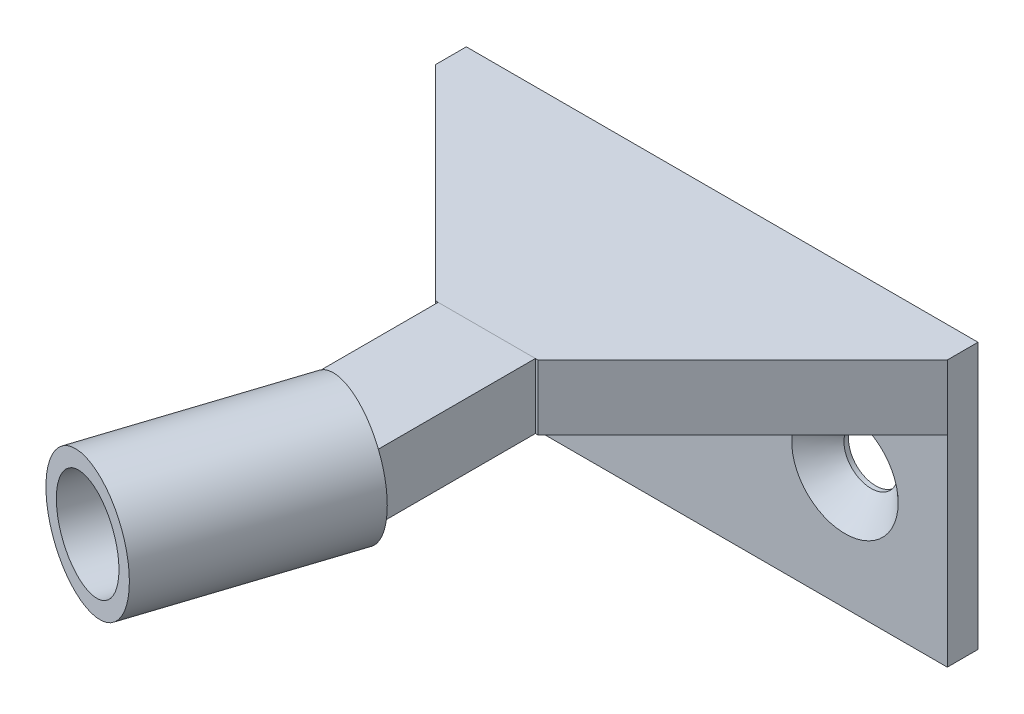
ISO-10303-21;
HEADER;
FILE_DESCRIPTION(('STEP AP214'),'2;1');
FILE_NAME('part.step','',(''),(''),'','','');
FILE_SCHEMA(('AUTOMOTIVE_DESIGN { 1 0 10303 214 1 1 1 1 }'));
ENDSEC;
DATA;
#1=APPLICATION_CONTEXT('core data for automotive mechanical design processes');
#2=APPLICATION_PROTOCOL_DEFINITION('international standard','automotive_design',2000,#1);
#3=PRODUCT_CONTEXT('',#1,'mechanical');
#4=PRODUCT('Part','Part','',(#3));
#5=PRODUCT_RELATED_PRODUCT_CATEGORY('part','',(#4));
#6=PRODUCT_DEFINITION_FORMATION('','',#4);
#7=PRODUCT_DEFINITION_CONTEXT('part definition',#1,'design');
#8=PRODUCT_DEFINITION('design','',#6,#7);
#9=PRODUCT_DEFINITION_SHAPE('','',#8);
#10=(LENGTH_UNIT() NAMED_UNIT(*) SI_UNIT(.MILLI.,.METRE.));
#11=(NAMED_UNIT(*) PLANE_ANGLE_UNIT() SI_UNIT($,.RADIAN.));
#12=(NAMED_UNIT(*) SI_UNIT($,.STERADIAN.) SOLID_ANGLE_UNIT());
#13=UNCERTAINTY_MEASURE_WITH_UNIT(LENGTH_MEASURE(1.E-05),#10,'distance_accuracy_value','');
#14=(GEOMETRIC_REPRESENTATION_CONTEXT(3) GLOBAL_UNCERTAINTY_ASSIGNED_CONTEXT((#13)) GLOBAL_UNIT_ASSIGNED_CONTEXT((#10,
#11,#12)) REPRESENTATION_CONTEXT('',''));
#15=CARTESIAN_POINT('',(0.,0.,0.));
#16=DIRECTION('',(0.,0.,1.));
#17=DIRECTION('',(1.,0.,0.));
#18=AXIS2_PLACEMENT_3D('',#15,#16,#17);
#19=CARTESIAN_POINT('',(0.,0.,23.));
#20=DIRECTION('',(0.,0.,1.));
#21=DIRECTION('',(1.,0.,0.));
#22=AXIS2_PLACEMENT_3D('',#19,#20,#21);
#23=PLANE('',#22);
#24=DIRECTION('',(0.,1.,0.));
#25=VECTOR('',#24,1.);
#26=CARTESIAN_POINT('',(4.75036715079468,6.64708638221506,23.));
#27=LINE('',#26,#25);
#28=CARTESIAN_POINT('',(4.75036715079468,6.65,23.));
#29=VERTEX_POINT('',#28);
#30=CARTESIAN_POINT('',(4.75036715079468,13.,23.));
#31=VERTEX_POINT('',#30);
#32=EDGE_CURVE('E12',#29,#31,#27,.T.);
#33=ORIENTED_EDGE('',*,*,#32,.F.);
#34=DIRECTION('',(1.,0.,0.));
#35=VECTOR('',#34,1.);
#36=CARTESIAN_POINT('',(-5.,6.65,23.));
#37=LINE('',#36,#35);
#38=CARTESIAN_POINT('',(5.,6.65,23.));
#39=VERTEX_POINT('',#38);
#40=EDGE_CURVE('E266',#29,#39,#37,.T.);
#41=ORIENTED_EDGE('',*,*,#40,.T.);
#42=DIRECTION('',(0.,-1.,0.));
#43=VECTOR('',#42,1.);
#44=CARTESIAN_POINT('',(5.,13.,23.));
#45=LINE('',#44,#43);
#46=CARTESIAN_POINT('',(5.,13.,23.));
#47=VERTEX_POINT('',#46);
#48=EDGE_CURVE('E403',#47,#39,#45,.T.);
#49=ORIENTED_EDGE('',*,*,#48,.F.);
#50=DIRECTION('',(1.,0.,0.));
#51=VECTOR('',#50,1.);
#52=CARTESIAN_POINT('',(-5.,13.,23.));
#53=LINE('',#52,#51);
#54=EDGE_CURVE('E70',#31,#47,#53,.T.);
#55=ORIENTED_EDGE('',*,*,#54,.F.);
#56=EDGE_LOOP('',(#33,#41,#49,#55));
#57=FACE_BOUND('',#56,.T.);
#58=ADVANCED_FACE('F53',(#57),#23,.T.);
#59=CARTESIAN_POINT('',(25.,-13.,3.));
#60=DIRECTION('',(-1.,0.,0.));
#61=DIRECTION('',(0.,0.,1.));
#62=AXIS2_PLACEMENT_3D('',#59,#60,#61);
#63=PLANE('',#62);
#64=DIRECTION('',(0.,1.,0.));
#65=VECTOR('',#64,1.);
#66=CARTESIAN_POINT('',(25.,-13.,0.));
#67=LINE('',#66,#65);
#68=CARTESIAN_POINT('',(25.,-13.,0.));
#69=VERTEX_POINT('',#68);
#70=CARTESIAN_POINT('',(25.,13.,0.));
#71=VERTEX_POINT('',#70);
#72=EDGE_CURVE('E348',#69,#71,#67,.T.);
#73=ORIENTED_EDGE('',*,*,#72,.T.);
#74=DIRECTION('',(0.,0.,-1.));
#75=VECTOR('',#74,1.);
#76=CARTESIAN_POINT('',(25.,13.,3.));
#77=LINE('',#76,#75);
#78=CARTESIAN_POINT('',(25.,13.,3.));
#79=VERTEX_POINT('',#78);
#80=EDGE_CURVE('E212',#79,#71,#77,.T.);
#81=ORIENTED_EDGE('',*,*,#80,.F.);
#82=DIRECTION('',(0.,1.,0.));
#83=VECTOR('',#82,1.);
#84=CARTESIAN_POINT('',(25.,13.,3.));
#85=LINE('',#84,#83);
#86=CARTESIAN_POINT('',(25.,6.65,3.));
#87=VERTEX_POINT('',#86);
#88=EDGE_CURVE('E347',#87,#79,#85,.T.);
#89=ORIENTED_EDGE('',*,*,#88,.F.);
#90=DIRECTION('',(0.,1.,0.));
#91=VECTOR('',#90,1.);
#92=CARTESIAN_POINT('',(25.,-13.,3.));
#93=LINE('',#92,#91);
#94=CARTESIAN_POINT('',(25.,-13.,3.));
#95=VERTEX_POINT('',#94);
#96=EDGE_CURVE('E373',#95,#87,#93,.T.);
#97=ORIENTED_EDGE('',*,*,#96,.F.);
#98=DIRECTION('',(0.,0.,-1.));
#99=VECTOR('',#98,1.);
#100=CARTESIAN_POINT('',(25.,-13.,3.));
#101=LINE('',#100,#99);
#102=EDGE_CURVE('E384',#95,#69,#101,.T.);
#103=ORIENTED_EDGE('',*,*,#102,.T.);
#104=EDGE_LOOP('',(#73,#81,#89,#97,#103));
#105=FACE_BOUND('',#104,.T.);
#106=ADVANCED_FACE('F55',(#105),#63,.F.);
#107=CARTESIAN_POINT('',(-25.,13.,3.));
#108=DIRECTION('',(0.,-1.,0.));
#109=DIRECTION('',(0.,0.,-1.));
#110=AXIS2_PLACEMENT_3D('',#107,#108,#109);
#111=PLANE('',#110);
#112=DIRECTION('',(-1.,0.,0.));
#113=VECTOR('',#112,1.);
#114=CARTESIAN_POINT('',(-25.,13.,0.));
#115=LINE('',#114,#113);
#116=CARTESIAN_POINT('',(-25.,13.,0.));
#117=VERTEX_POINT('',#116);
#118=EDGE_CURVE('E356',#71,#117,#115,.T.);
#119=ORIENTED_EDGE('',*,*,#118,.T.);
#120=DIRECTION('',(0.,0.,-1.));
#121=VECTOR('',#120,1.);
#122=CARTESIAN_POINT('',(-25.,13.,3.));
#123=LINE('',#122,#121);
#124=CARTESIAN_POINT('',(-25.,13.,3.));
#125=VERTEX_POINT('',#124);
#126=EDGE_CURVE('E364',#125,#117,#123,.T.);
#127=ORIENTED_EDGE('',*,*,#126,.F.);
#128=DIRECTION('',(-0.707106781186548,0.,-0.707106781186547));
#129=VECTOR('',#128,1.);
#130=CARTESIAN_POINT('',(-5.,13.,23.));
#131=LINE('',#130,#129);
#132=CARTESIAN_POINT('',(-5.,13.,23.));
#133=VERTEX_POINT('',#132);
#134=EDGE_CURVE('E361',#133,#125,#131,.T.);
#135=ORIENTED_EDGE('',*,*,#134,.F.);
#136=CARTESIAN_POINT('',(-4.75150429364503,13.,23.));
#137=VERTEX_POINT('',#136);
#138=EDGE_CURVE('E289',#133,#137,#53,.T.);
#139=ORIENTED_EDGE('',*,*,#138,.T.);
#140=EDGE_CURVE('E407',#137,#31,#53,.T.);
#141=ORIENTED_EDGE('',*,*,#140,.T.);
#142=ORIENTED_EDGE('',*,*,#54,.T.);
#143=DIRECTION('',(0.707106781186548,0.,-0.707106781186547));
#144=VECTOR('',#143,1.);
#145=CARTESIAN_POINT('',(5.,13.,23.));
#146=LINE('',#145,#144);
#147=EDGE_CURVE('E358',#47,#79,#146,.T.);
#148=ORIENTED_EDGE('',*,*,#147,.T.);
#149=ORIENTED_EDGE('',*,*,#80,.T.);
#150=EDGE_LOOP('',(#119,#127,#135,#139,#141,#142,#148,#149));
#151=FACE_BOUND('',#150,.T.);
#152=ADVANCED_FACE('F327',(#151),#111,.F.);
#153=CARTESIAN_POINT('',(-25.,-13.,3.));
#154=DIRECTION('',(1.,0.,0.));
#155=DIRECTION('',(0.,0.,-1.));
#156=AXIS2_PLACEMENT_3D('',#153,#154,#155);
#157=PLANE('',#156);
#158=DIRECTION('',(0.,-1.,0.));
#159=VECTOR('',#158,1.);
#160=CARTESIAN_POINT('',(-25.,-13.,0.));
#161=LINE('',#160,#159);
#162=CARTESIAN_POINT('',(-25.,-13.,0.));
#163=VERTEX_POINT('',#162);
#164=EDGE_CURVE('E387',#117,#163,#161,.T.);
#165=ORIENTED_EDGE('',*,*,#164,.T.);
#166=DIRECTION('',(0.,0.,-1.));
#167=VECTOR('',#166,1.);
#168=CARTESIAN_POINT('',(-25.,-13.,3.));
#169=LINE('',#168,#167);
#170=CARTESIAN_POINT('',(-25.,-13.,3.));
#171=VERTEX_POINT('',#170);
#172=EDGE_CURVE('E368',#171,#163,#169,.T.);
#173=ORIENTED_EDGE('',*,*,#172,.F.);
#174=DIRECTION('',(0.,-1.,0.));
#175=VECTOR('',#174,1.);
#176=CARTESIAN_POINT('',(-25.,-13.,3.));
#177=LINE('',#176,#175);
#178=CARTESIAN_POINT('',(-25.,6.65,3.));
#179=VERTEX_POINT('',#178);
#180=EDGE_CURVE('E346',#179,#171,#177,.T.);
#181=ORIENTED_EDGE('',*,*,#180,.F.);
#182=DIRECTION('',(0.,1.,0.));
#183=VECTOR('',#182,1.);
#184=CARTESIAN_POINT('',(-25.,0.,3.));
#185=LINE('',#184,#183);
#186=EDGE_CURVE('E337',#125,#179,#185,.F.);
#187=ORIENTED_EDGE('',*,*,#186,.F.);
#188=ORIENTED_EDGE('',*,*,#126,.T.);
#189=EDGE_LOOP('',(#165,#173,#181,#187,#188));
#190=FACE_BOUND('',#189,.T.);
#191=ADVANCED_FACE('F324',(#190),#157,.F.);
#192=CARTESIAN_POINT('',(-25.,-13.,3.));
#193=DIRECTION('',(0.,1.,0.));
#194=DIRECTION('',(0.,0.,1.));
#195=AXIS2_PLACEMENT_3D('',#192,#193,#194);
#196=PLANE('',#195);
#197=DIRECTION('',(1.,0.,0.));
#198=VECTOR('',#197,1.);
#199=CARTESIAN_POINT('',(-25.,-13.,0.));
#200=LINE('',#199,#198);
#201=EDGE_CURVE('E377',#163,#69,#200,.T.);
#202=ORIENTED_EDGE('',*,*,#201,.T.);
#203=ORIENTED_EDGE('',*,*,#102,.F.);
#204=DIRECTION('',(1.,0.,0.));
#205=VECTOR('',#204,1.);
#206=CARTESIAN_POINT('',(-25.,-13.,3.));
#207=LINE('',#206,#205);
#208=EDGE_CURVE('E345',#171,#95,#207,.T.);
#209=ORIENTED_EDGE('',*,*,#208,.F.);
#210=ORIENTED_EDGE('',*,*,#172,.T.);
#211=EDGE_LOOP('',(#202,#203,#209,#210));
#212=FACE_BOUND('',#211,.T.);
#213=ADVANCED_FACE('F317',(#212),#196,.F.);
#214=CARTESIAN_POINT('',(0.,0.,3.));
#215=DIRECTION('',(0.,0.,-1.));
#216=DIRECTION('',(-1.,0.,0.));
#217=AXIS2_PLACEMENT_3D('',#214,#215,#216);
#218=PLANE('',#217);
#219=CARTESIAN_POINT('',(-15.,-1.5,3.));
#220=DIRECTION('',(0.,0.,1.));
#221=DIRECTION('',(1.,0.,0.));
#222=AXIS2_PLACEMENT_3D('',#219,#220,#221);
#223=CIRCLE('',#222,5.2);
#224=CARTESIAN_POINT('',(-9.8,-1.5,3.));
#225=VERTEX_POINT('',#224);
#226=EDGE_CURVE('E630',#225,#225,#223,.T.);
#227=ORIENTED_EDGE('',*,*,#226,.F.);
#228=EDGE_LOOP('',(#227));
#229=FACE_BOUND('',#228,.T.);
#230=CARTESIAN_POINT('',(15.,-1.5,3.));
#231=DIRECTION('',(0.,0.,1.));
#232=DIRECTION('',(1.,0.,0.));
#233=AXIS2_PLACEMENT_3D('',#230,#231,#232);
#234=CIRCLE('',#233,5.2);
#235=CARTESIAN_POINT('',(20.2,-1.5,3.));
#236=VERTEX_POINT('',#235);
#237=EDGE_CURVE('E443',#236,#236,#234,.T.);
#238=ORIENTED_EDGE('',*,*,#237,.F.);
#239=EDGE_LOOP('',(#238));
#240=FACE_BOUND('',#239,.T.);
#241=ORIENTED_EDGE('',*,*,#96,.T.);
#242=DIRECTION('',(1.,0.,0.));
#243=VECTOR('',#242,1.);
#244=CARTESIAN_POINT('',(-25.,6.65,3.));
#245=LINE('',#244,#243);
#246=EDGE_CURVE('E349',#179,#87,#245,.T.);
#247=ORIENTED_EDGE('',*,*,#246,.F.);
#248=ORIENTED_EDGE('',*,*,#180,.T.);
#249=ORIENTED_EDGE('',*,*,#208,.T.);
#250=EDGE_LOOP('',(#241,#247,#248,#249));
#251=FACE_BOUND('',#250,.T.);
#252=ADVANCED_FACE('F314',(#229,#240,#251),#218,.F.);
#253=CARTESIAN_POINT('',(0.,0.,0.));
#254=DIRECTION('',(0.,0.,-1.));
#255=DIRECTION('',(-1.,0.,0.));
#256=AXIS2_PLACEMENT_3D('',#253,#254,#255);
#257=PLANE('',#256);
#258=CARTESIAN_POINT('',(-15.,-1.5,0.));
#259=DIRECTION('',(0.,0.,-1.));
#260=DIRECTION('',(-1.,0.,0.));
#261=AXIS2_PLACEMENT_3D('',#258,#259,#260);
#262=CIRCLE('',#261,2.64999999999999);
#263=CARTESIAN_POINT('',(-17.65,-1.5,0.));
#264=VERTEX_POINT('',#263);
#265=EDGE_CURVE('E57',#264,#264,#262,.T.);
#266=ORIENTED_EDGE('',*,*,#265,.F.);
#267=EDGE_LOOP('',(#266));
#268=FACE_BOUND('',#267,.T.);
#269=CARTESIAN_POINT('',(15.,-1.5,0.));
#270=DIRECTION('',(0.,0.,-1.));
#271=DIRECTION('',(-1.,0.,0.));
#272=AXIS2_PLACEMENT_3D('',#269,#270,#271);
#273=CIRCLE('',#272,2.64999999999999);
#274=CARTESIAN_POINT('',(12.35,-1.5,0.));
#275=VERTEX_POINT('',#274);
#276=EDGE_CURVE('E436',#275,#275,#273,.T.);
#277=ORIENTED_EDGE('',*,*,#276,.F.);
#278=EDGE_LOOP('',(#277));
#279=FACE_BOUND('',#278,.T.);
#280=ORIENTED_EDGE('',*,*,#72,.F.);
#281=ORIENTED_EDGE('',*,*,#201,.F.);
#282=ORIENTED_EDGE('',*,*,#164,.F.);
#283=ORIENTED_EDGE('',*,*,#118,.F.);
#284=EDGE_LOOP('',(#280,#281,#282,#283));
#285=FACE_BOUND('',#284,.T.);
#286=ADVANCED_FACE('F237',(#268,#279,#285),#257,.T.);
#287=DIRECTION('',(0.,-1.,0.));
#288=VECTOR('',#287,1.);
#289=CARTESIAN_POINT('',(-4.75150429364503,13.0004552442555,23.));
#290=LINE('',#289,#288);
#291=CARTESIAN_POINT('',(-4.75150429364502,6.65,23.));
#292=VERTEX_POINT('',#291);
#293=EDGE_CURVE('E62',#137,#292,#290,.T.);
#294=ORIENTED_EDGE('',*,*,#293,.F.);
#295=ORIENTED_EDGE('',*,*,#138,.F.);
#296=DIRECTION('',(0.,-1.,0.));
#297=VECTOR('',#296,1.);
#298=CARTESIAN_POINT('',(-5.,13.,23.));
#299=LINE('',#298,#297);
#300=CARTESIAN_POINT('',(-5.,6.65,23.));
#301=VERTEX_POINT('',#300);
#302=EDGE_CURVE('E223',#133,#301,#299,.T.);
#303=ORIENTED_EDGE('',*,*,#302,.T.);
#304=EDGE_CURVE('E405',#301,#292,#37,.T.);
#305=ORIENTED_EDGE('',*,*,#304,.T.);
#306=EDGE_LOOP('',(#294,#295,#303,#305));
#307=FACE_BOUND('',#306,.T.);
#308=ADVANCED_FACE('F226',(#307),#23,.T.);
#309=CARTESIAN_POINT('',(0.,6.65,0.));
#310=DIRECTION('',(0.,-1.,0.));
#311=DIRECTION('',(0.,0.,-1.));
#312=AXIS2_PLACEMENT_3D('',#309,#310,#311);
#313=PLANE('',#312);
#314=DIRECTION('',(-0.707106781186548,0.,-0.707106781186547));
#315=VECTOR('',#314,1.);
#316=CARTESIAN_POINT('',(-5.,6.65,23.));
#317=LINE('',#316,#315);
#318=EDGE_CURVE('E280',#301,#179,#317,.T.);
#319=ORIENTED_EDGE('',*,*,#318,.T.);
#320=ORIENTED_EDGE('',*,*,#246,.T.);
#321=DIRECTION('',(0.707106781186548,0.,-0.707106781186547));
#322=VECTOR('',#321,1.);
#323=CARTESIAN_POINT('',(5.,6.65,23.));
#324=LINE('',#323,#322);
#325=EDGE_CURVE('E288',#39,#87,#324,.T.);
#326=ORIENTED_EDGE('',*,*,#325,.F.);
#327=ORIENTED_EDGE('',*,*,#40,.F.);
#328=EDGE_CURVE('E409',#292,#29,#37,.T.);
#329=ORIENTED_EDGE('',*,*,#328,.F.);
#330=ORIENTED_EDGE('',*,*,#304,.F.);
#331=EDGE_LOOP('',(#319,#320,#326,#327,#329,#330));
#332=FACE_BOUND('',#331,.T.);
#333=ADVANCED_FACE('F236',(#332),#313,.T.);
#334=CARTESIAN_POINT('',(14.,0.,14.));
#335=DIRECTION('',(0.707106781186547,0.,0.707106781186548));
#336=DIRECTION('',(0.707106781186548,0.,-0.707106781186547));
#337=AXIS2_PLACEMENT_3D('',#334,#335,#336);
#338=PLANE('',#337);
#339=ORIENTED_EDGE('',*,*,#325,.T.);
#340=ORIENTED_EDGE('',*,*,#88,.T.);
#341=ORIENTED_EDGE('',*,*,#147,.F.);
#342=ORIENTED_EDGE('',*,*,#48,.T.);
#343=EDGE_LOOP('',(#339,#340,#341,#342));
#344=FACE_BOUND('',#343,.T.);
#345=ADVANCED_FACE('F312',(#344),#338,.T.);
#346=CARTESIAN_POINT('',(-14.,0.,14.));
#347=DIRECTION('',(-0.707106781186547,0.,0.707106781186548));
#348=DIRECTION('',(0.707106781186548,0.,0.707106781186547));
#349=AXIS2_PLACEMENT_3D('',#346,#347,#348);
#350=PLANE('',#349);
#351=ORIENTED_EDGE('',*,*,#134,.T.);
#352=ORIENTED_EDGE('',*,*,#186,.T.);
#353=ORIENTED_EDGE('',*,*,#318,.F.);
#354=ORIENTED_EDGE('',*,*,#302,.F.);
#355=EDGE_LOOP('',(#351,#352,#353,#354));
#356=FACE_BOUND('',#355,.T.);
#357=ADVANCED_FACE('F302',(#356),#350,.T.);
#358=CARTESIAN_POINT('',(0.,0.,23.));
#359=DIRECTION('',(0.,0.,1.));
#360=DIRECTION('',(1.,0.,0.));
#361=AXIS2_PLACEMENT_3D('',#358,#359,#360);
#362=PLANE('',#361);
#363=CARTESIAN_POINT('',(-4.75150429364502,6.64708638221506,23.));
#364=VERTEX_POINT('',#363);
#365=EDGE_CURVE('E206',#292,#364,#290,.T.);
#366=ORIENTED_EDGE('',*,*,#365,.F.);
#367=ORIENTED_EDGE('',*,*,#328,.T.);
#368=CARTESIAN_POINT('',(4.75036715079468,6.64708638221506,23.));
#369=VERTEX_POINT('',#368);
#370=EDGE_CURVE('E156',#369,#29,#27,.T.);
#371=ORIENTED_EDGE('',*,*,#370,.F.);
#372=DIRECTION('',(1.,0.,0.));
#373=VECTOR('',#372,1.);
#374=CARTESIAN_POINT('',(-4.75150429364502,6.64708638221506,23.));
#375=LINE('',#374,#373);
#376=EDGE_CURVE('E194',#364,#369,#375,.T.);
#377=ORIENTED_EDGE('',*,*,#376,.F.);
#378=EDGE_LOOP('',(#366,#367,#371,#377));
#379=FACE_BOUND('',#378,.T.);
#380=ADVANCED_FACE('F311',(#379),#362,.F.);
#381=DIRECTION('',(-0.999999998852268,4.79110096994007E-05,0.));
#382=VECTOR('',#381,1.);
#383=CARTESIAN_POINT('',(4.75036715079468,13.,23.));
#384=LINE('',#383,#382);
#385=CARTESIAN_POINT('',(-4.75150429364503,13.0004552442555,23.));
#386=VERTEX_POINT('',#385);
#387=EDGE_CURVE('E205',#31,#386,#384,.T.);
#388=ORIENTED_EDGE('',*,*,#387,.F.);
#389=ORIENTED_EDGE('',*,*,#140,.F.);
#390=EDGE_CURVE('E202',#386,#137,#290,.T.);
#391=ORIENTED_EDGE('',*,*,#390,.F.);
#392=EDGE_LOOP('',(#388,#389,#391));
#393=FACE_BOUND('',#392,.T.);
#394=ADVANCED_FACE('F421',(#393),#362,.F.);
#395=CARTESIAN_POINT('',(-4.75150429364503,13.0004552442555,57.7863261489491));
#396=DIRECTION('',(1.,0.,0.));
#397=DIRECTION('',(0.,1.,0.));
#398=AXIS2_PLACEMENT_3D('',#395,#396,#397);
#399=PLANE('',#398);
#400=DIRECTION('',(0.,-1.,0.));
#401=VECTOR('',#400,1.);
#402=CARTESIAN_POINT('',(-4.75150429364503,13.0004552442555,35.2573205165989));
#403=LINE('',#402,#401);
#404=CARTESIAN_POINT('',(-4.75150429364503,13.0004552442555,35.2573205165989));
#405=VERTEX_POINT('',#404);
#406=CARTESIAN_POINT('',(-4.75150429364503,6.64708638221506,35.2573205165989));
#407=VERTEX_POINT('',#406);
#408=EDGE_CURVE('E167',#405,#407,#403,.T.);
#409=ORIENTED_EDGE('',*,*,#408,.F.);
#410=DIRECTION('',(0.,0.,-1.));
#411=VECTOR('',#410,1.);
#412=CARTESIAN_POINT('',(-4.75150429364503,13.0004552442555,57.7863261489491));
#413=LINE('',#412,#411);
#414=EDGE_CURVE('E163',#405,#386,#413,.T.);
#415=ORIENTED_EDGE('',*,*,#414,.T.);
#416=ORIENTED_EDGE('',*,*,#390,.T.);
#417=ORIENTED_EDGE('',*,*,#293,.T.);
#418=ORIENTED_EDGE('',*,*,#365,.T.);
#419=DIRECTION('',(0.,0.,-1.));
#420=VECTOR('',#419,1.);
#421=CARTESIAN_POINT('',(-4.75150429364502,6.64708638221506,57.7863261489491));
#422=LINE('',#421,#420);
#423=EDGE_CURVE('E425',#407,#364,#422,.T.);
#424=ORIENTED_EDGE('',*,*,#423,.F.);
#425=EDGE_LOOP('',(#409,#415,#416,#417,#418,#424));
#426=FACE_BOUND('',#425,.T.);
#427=ADVANCED_FACE('F423',(#426),#399,.F.);
#428=CARTESIAN_POINT('',(4.75036715079468,13.,57.7863261489491));
#429=DIRECTION('',(-4.79110096994007E-05,-0.999999998852267,0.));
#430=DIRECTION('',(0.999999998852268,-4.79110096994008E-05,0.));
#431=AXIS2_PLACEMENT_3D('',#428,#429,#430);
#432=PLANE('',#431);
#433=DIRECTION('',(-0.951056515307828,4.55660779818893E-05,-0.30901699405415));
#434=VECTOR('',#433,1.);
#435=CARTESIAN_POINT('',(10.4641277849252,12.9997262479585,40.2011790695597));
#436=LINE('',#435,#434);
#437=CARTESIAN_POINT('',(4.75036715079468,13.,38.3446656999704));
#438=VERTEX_POINT('',#437);
#439=EDGE_CURVE('E161',#438,#405,#436,.T.);
#440=ORIENTED_EDGE('',*,*,#439,.F.);
#441=DIRECTION('',(0.,0.,-1.));
#442=VECTOR('',#441,1.);
#443=CARTESIAN_POINT('',(4.75036715079468,13.,57.7863261489491));
#444=LINE('',#443,#442);
#445=EDGE_CURVE('E146',#438,#31,#444,.T.);
#446=ORIENTED_EDGE('',*,*,#445,.T.);
#447=ORIENTED_EDGE('',*,*,#387,.T.);
#448=ORIENTED_EDGE('',*,*,#414,.F.);
#449=EDGE_LOOP('',(#440,#446,#447,#448));
#450=FACE_BOUND('',#449,.T.);
#451=ADVANCED_FACE('F162',(#450),#432,.F.);
#452=CARTESIAN_POINT('',(-4.75150429364502,6.64708638221506,57.7863261489491));
#453=DIRECTION('',(0.,1.,0.));
#454=DIRECTION('',(0.,0.,1.));
#455=AXIS2_PLACEMENT_3D('',#452,#453,#454);
#456=PLANE('',#455);
#457=DIRECTION('',(0.951056516295152,0.,0.309016994374951));
#458=VECTOR('',#457,1.);
#459=CARTESIAN_POINT('',(1.8696043361098,6.64708638221506,37.4086491213039));
#460=LINE('',#459,#458);
#461=CARTESIAN_POINT('',(4.75036715079468,6.64708638221506,38.3446656999704));
#462=VERTEX_POINT('',#461);
#463=EDGE_CURVE('E176',#407,#462,#460,.T.);
#464=ORIENTED_EDGE('',*,*,#463,.F.);
#465=ORIENTED_EDGE('',*,*,#423,.T.);
#466=ORIENTED_EDGE('',*,*,#376,.T.);
#467=DIRECTION('',(0.,0.,-1.));
#468=VECTOR('',#467,1.);
#469=CARTESIAN_POINT('',(4.75036715079468,6.64708638221506,57.7863261489491));
#470=LINE('',#469,#468);
#471=EDGE_CURVE('E157',#462,#369,#470,.T.);
#472=ORIENTED_EDGE('',*,*,#471,.F.);
#473=EDGE_LOOP('',(#464,#465,#466,#472));
#474=FACE_BOUND('',#473,.T.);
#475=ADVANCED_FACE('F433',(#474),#456,.F.);
#476=CARTESIAN_POINT('',(4.75036715079468,6.64708638221506,57.7863261489491));
#477=DIRECTION('',(-1.,0.,0.));
#478=DIRECTION('',(0.,-1.,0.));
#479=AXIS2_PLACEMENT_3D('',#476,#477,#478);
#480=PLANE('',#479);
#481=DIRECTION('',(0.,1.,0.));
#482=VECTOR('',#481,1.);
#483=CARTESIAN_POINT('',(4.75036715079468,6.64708638221506,38.3446656999704));
#484=LINE('',#483,#482);
#485=EDGE_CURVE('E150',#462,#438,#484,.T.);
#486=ORIENTED_EDGE('',*,*,#485,.F.);
#487=ORIENTED_EDGE('',*,*,#471,.T.);
#488=ORIENTED_EDGE('',*,*,#370,.T.);
#489=ORIENTED_EDGE('',*,*,#32,.T.);
#490=ORIENTED_EDGE('',*,*,#445,.F.);
#491=EDGE_LOOP('',(#486,#487,#488,#489,#490));
#492=FACE_BOUND('',#491,.T.);
#493=ADVANCED_FACE('F148',(#492),#480,.F.);
#494=CARTESIAN_POINT('',(-0.000738458077878708,9.08,36.8009379087651));
#495=DIRECTION('',(-0.309016994374951,0.,0.951056516295152));
#496=DIRECTION('',(0.951056516295152,0.,0.309016994374951));
#497=AXIS2_PLACEMENT_3D('',#494,#495,#496);
#498=PLANE('',#497);
#499=CARTESIAN_POINT('',(-0.000738458077878708,9.08,36.8009379087651));
#500=DIRECTION('',(-0.309016994374951,0.,0.951056516295152));
#501=DIRECTION('',(0.951056516295152,0.,0.309016994374951));
#502=AXIS2_PLACEMENT_3D('',#499,#500,#501);
#503=CIRCLE('',#502,6.35);
#504=EDGE_CURVE('E177',#438,#405,#503,.T.);
#505=ORIENTED_EDGE('',*,*,#504,.F.);
#506=ORIENTED_EDGE('',*,*,#439,.T.);
#507=EDGE_LOOP('',(#505,#506));
#508=FACE_BOUND('',#507,.T.);
#509=ADVANCED_FACE('F184',(#508),#498,.F.);
#510=CARTESIAN_POINT('',(-0.000738458077878708,9.08,36.8009379087651));
#511=DIRECTION('',(-0.309016994374951,0.,0.951056516295152));
#512=DIRECTION('',(0.951056516295152,0.,0.309016994374951));
#513=AXIS2_PLACEMENT_3D('',#510,#511,#512);
#514=CYLINDRICAL_SURFACE('',#513,6.35);
#515=ORIENTED_EDGE('',*,*,#504,.T.);
#516=EDGE_CURVE('E174',#405,#438,#503,.T.);
#517=ORIENTED_EDGE('',*,*,#516,.T.);
#518=EDGE_LOOP('',(#515,#517));
#519=FACE_BOUND('',#518,.T.);
#520=CARTESIAN_POINT('',(-6.18107834557691,9.08,55.8220682346681));
#521=DIRECTION('',(-0.309016994374951,0.,0.951056516295152));
#522=DIRECTION('',(0.951056516295152,0.,0.309016994374951));
#523=AXIS2_PLACEMENT_3D('',#520,#521,#522);
#524=CIRCLE('',#523,6.35);
#525=CARTESIAN_POINT('',(-0.141869467102687,9.08,57.7843261489491));
#526=VERTEX_POINT('',#525);
#527=EDGE_CURVE('E182',#526,#526,#524,.T.);
#528=ORIENTED_EDGE('',*,*,#527,.F.);
#529=EDGE_LOOP('',(#528));
#530=FACE_BOUND('',#529,.T.);
#531=ADVANCED_FACE('F180',(#519,#530),#514,.T.);
#532=ORIENTED_EDGE('',*,*,#516,.F.);
#533=ORIENTED_EDGE('',*,*,#408,.T.);
#534=ORIENTED_EDGE('',*,*,#463,.T.);
#535=ORIENTED_EDGE('',*,*,#485,.T.);
#536=EDGE_LOOP('',(#532,#533,#534,#535));
#537=FACE_BOUND('',#536,.T.);
#538=ADVANCED_FACE('F172',(#537),#498,.F.);
#539=CARTESIAN_POINT('',(-6.18107834557691,9.08,55.8220682346681));
#540=DIRECTION('',(-0.309016994374951,0.,0.951056516295152));
#541=DIRECTION('',(0.951056516295152,0.,0.309016994374951));
#542=AXIS2_PLACEMENT_3D('',#539,#540,#541);
#543=PLANE('',#542);
#544=CARTESIAN_POINT('',(-6.18107834557691,9.08,55.8220682346681));
#545=DIRECTION('',(-0.309016994374951,0.,0.951056516295152));
#546=DIRECTION('',(0.951056516295152,0.,0.309016994374951));
#547=AXIS2_PLACEMENT_3D('',#544,#545,#546);
#548=CIRCLE('',#547,4.76250000000001);
#549=CARTESIAN_POINT('',(-1.65167168672124,9.08,57.2937616703788));
#550=VERTEX_POINT('',#549);
#551=EDGE_CURVE('E187',#550,#550,#548,.T.);
#552=ORIENTED_EDGE('',*,*,#551,.F.);
#553=EDGE_LOOP('',(#552));
#554=FACE_BOUND('',#553,.T.);
#555=ORIENTED_EDGE('',*,*,#527,.T.);
#556=EDGE_LOOP('',(#555));
#557=FACE_BOUND('',#556,.T.);
#558=ADVANCED_FACE('F458',(#554,#557),#543,.T.);
#559=CARTESIAN_POINT('',(-1.54582342995264,9.08,41.5562204902409));
#560=DIRECTION('',(-0.309016994374951,0.,0.951056516295152));
#561=DIRECTION('',(0.951056516295152,0.,0.309016994374951));
#562=AXIS2_PLACEMENT_3D('',#559,#560,#561);
#563=CYLINDRICAL_SURFACE('',#562,4.76250000000001);
#564=CARTESIAN_POINT('',(-1.54582342995264,9.08,41.5562204902409));
#565=DIRECTION('',(-0.309016994374951,0.,0.951056516295152));
#566=DIRECTION('',(0.951056516295152,0.,0.309016994374951));
#567=AXIS2_PLACEMENT_3D('',#564,#565,#566);
#568=CIRCLE('',#567,4.76250000000001);
#569=CARTESIAN_POINT('',(2.98358322890303,9.08,43.0279139259516));
#570=VERTEX_POINT('',#569);
#571=EDGE_CURVE('E191',#570,#570,#568,.T.);
#572=ORIENTED_EDGE('',*,*,#571,.F.);
#573=EDGE_LOOP('',(#572));
#574=FACE_BOUND('',#573,.T.);
#575=ORIENTED_EDGE('',*,*,#551,.T.);
#576=EDGE_LOOP('',(#575));
#577=FACE_BOUND('',#576,.T.);
#578=ADVANCED_FACE('F455',(#574,#577),#563,.F.);
#579=CARTESIAN_POINT('',(-1.54582342995264,9.08,41.5562204902409));
#580=DIRECTION('',(-0.309016994374951,0.,0.951056516295152));
#581=DIRECTION('',(0.951056516295152,0.,0.309016994374951));
#582=AXIS2_PLACEMENT_3D('',#579,#580,#581);
#583=PLANE('',#582);
#584=ORIENTED_EDGE('',*,*,#571,.T.);
#585=EDGE_LOOP('',(#584));
#586=FACE_BOUND('',#585,.T.);
#587=ADVANCED_FACE('F453',(#586),#583,.T.);
#588=CARTESIAN_POINT('',(15.,-1.5,3.));
#589=DIRECTION('',(0.,0.,1.));
#590=DIRECTION('',(1.,0.,0.));
#591=AXIS2_PLACEMENT_3D('',#588,#589,#590);
#592=CYLINDRICAL_SURFACE('',#591,2.64999999999999);
#593=ORIENTED_EDGE('',*,*,#276,.T.);
#594=EDGE_LOOP('',(#593));
#595=FACE_BOUND('',#594,.T.);
#596=CARTESIAN_POINT('',(15.,-1.5,0.449999999999989));
#597=DIRECTION('',(0.,0.,1.));
#598=DIRECTION('',(1.,0.,0.));
#599=AXIS2_PLACEMENT_3D('',#596,#597,#598);
#600=CIRCLE('',#599,2.64999999999999);
#601=CARTESIAN_POINT('',(17.65,-1.5,0.449999999999989));
#602=VERTEX_POINT('',#601);
#603=EDGE_CURVE('E438',#602,#602,#600,.T.);
#604=ORIENTED_EDGE('',*,*,#603,.T.);
#605=EDGE_LOOP('',(#604));
#606=FACE_BOUND('',#605,.T.);
#607=ADVANCED_FACE('F540',(#595,#606),#592,.F.);
#608=CARTESIAN_POINT('',(15.,-1.5,3.));
#609=DIRECTION('',(0.,0.,1.));
#610=DIRECTION('',(1.,0.,0.));
#611=AXIS2_PLACEMENT_3D('',#608,#609,#610);
#612=CONICAL_SURFACE('',#611,5.2,0.785398163397448);
#613=ORIENTED_EDGE('',*,*,#603,.F.);
#614=EDGE_LOOP('',(#613));
#615=FACE_BOUND('',#614,.T.);
#616=ORIENTED_EDGE('',*,*,#237,.T.);
#617=EDGE_LOOP('',(#616));
#618=FACE_BOUND('',#617,.T.);
#619=ADVANCED_FACE('F592',(#615,#618),#612,.F.);
#620=CARTESIAN_POINT('',(-15.,-1.5,3.));
#621=DIRECTION('',(0.,0.,1.));
#622=DIRECTION('',(1.,0.,0.));
#623=AXIS2_PLACEMENT_3D('',#620,#621,#622);
#624=CYLINDRICAL_SURFACE('',#623,2.64999999999999);
#625=ORIENTED_EDGE('',*,*,#265,.T.);
#626=EDGE_LOOP('',(#625));
#627=FACE_BOUND('',#626,.T.);
#628=CARTESIAN_POINT('',(-15.,-1.5,0.449999999999989));
#629=DIRECTION('',(0.,0.,1.));
#630=DIRECTION('',(1.,0.,0.));
#631=AXIS2_PLACEMENT_3D('',#628,#629,#630);
#632=CIRCLE('',#631,2.64999999999999);
#633=CARTESIAN_POINT('',(-12.35,-1.5,0.449999999999989));
#634=VERTEX_POINT('',#633);
#635=EDGE_CURVE('E627',#634,#634,#632,.T.);
#636=ORIENTED_EDGE('',*,*,#635,.T.);
#637=EDGE_LOOP('',(#636));
#638=FACE_BOUND('',#637,.T.);
#639=ADVANCED_FACE('F601',(#627,#638),#624,.F.);
#640=CARTESIAN_POINT('',(-15.,-1.5,3.));
#641=DIRECTION('',(0.,0.,1.));
#642=DIRECTION('',(1.,0.,0.));
#643=AXIS2_PLACEMENT_3D('',#640,#641,#642);
#644=CONICAL_SURFACE('',#643,5.2,0.785398163397448);
#645=ORIENTED_EDGE('',*,*,#635,.F.);
#646=EDGE_LOOP('',(#645));
#647=FACE_BOUND('',#646,.T.);
#648=ORIENTED_EDGE('',*,*,#226,.T.);
#649=EDGE_LOOP('',(#648));
#650=FACE_BOUND('',#649,.T.);
#651=ADVANCED_FACE('F611',(#647,#650),#644,.F.);
#652=CLOSED_SHELL('',(#58,#106,#152,#191,#213,#252,#286,#308,#333,#345,#357,#380,#394,#427,#451,
#475,#493,#509,#531,#538,#558,#578,#587,#607,#619,#639,#651));
#653=MANIFOLD_SOLID_BREP('B2',#652);
#654=ADVANCED_BREP_SHAPE_REPRESENTATION('',(#18,#653),#14);
#655=SHAPE_DEFINITION_REPRESENTATION(#9,#654);
ENDSEC;
END-ISO-10303-21;
